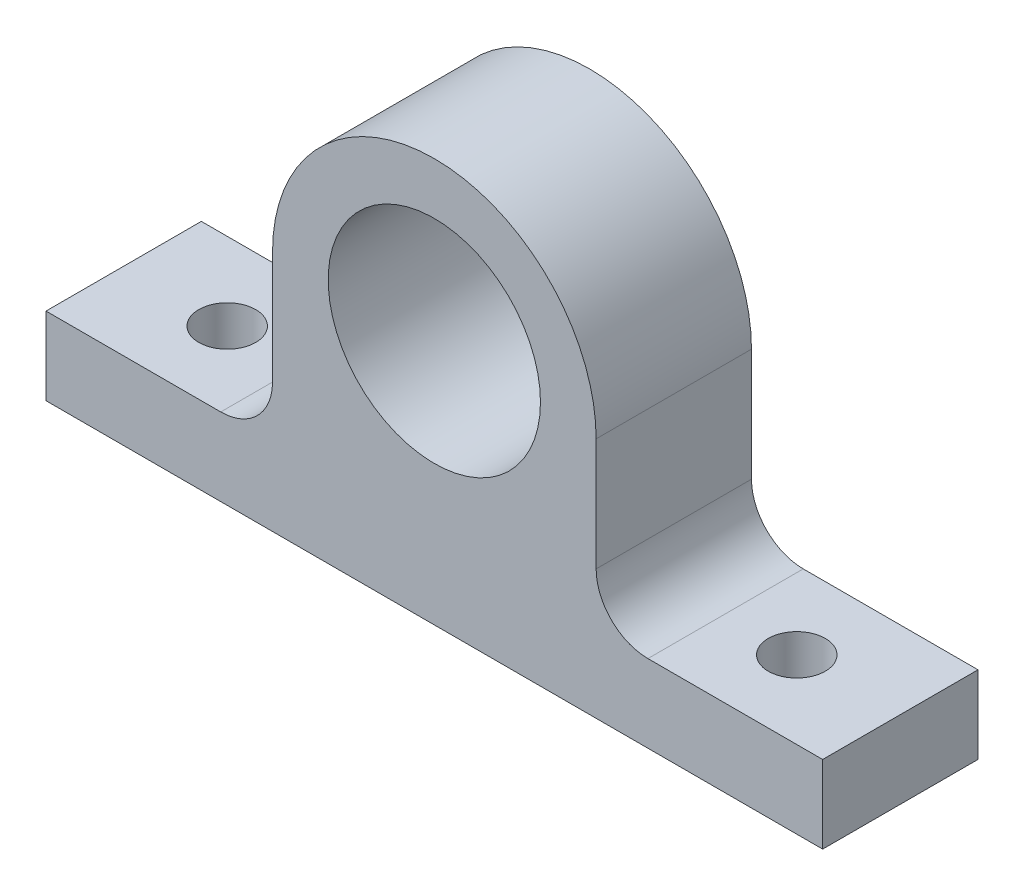
ISO-10303-21;
HEADER;
FILE_DESCRIPTION(('STEP AP214'),'2;1');
FILE_NAME('part.step','',(''),(''),'','','');
FILE_SCHEMA(('AUTOMOTIVE_DESIGN { 1 0 10303 214 1 1 1 1 }'));
ENDSEC;
DATA;
#1=APPLICATION_CONTEXT('core data for automotive mechanical design processes');
#2=APPLICATION_PROTOCOL_DEFINITION('international standard','automotive_design',2000,#1);
#3=PRODUCT_CONTEXT('',#1,'mechanical');
#4=PRODUCT('Part','Part','',(#3));
#5=PRODUCT_RELATED_PRODUCT_CATEGORY('part','',(#4));
#6=PRODUCT_DEFINITION_FORMATION('','',#4);
#7=PRODUCT_DEFINITION_CONTEXT('part definition',#1,'design');
#8=PRODUCT_DEFINITION('design','',#6,#7);
#9=PRODUCT_DEFINITION_SHAPE('','',#8);
#10=(LENGTH_UNIT() NAMED_UNIT(*) SI_UNIT(.MILLI.,.METRE.));
#11=(NAMED_UNIT(*) PLANE_ANGLE_UNIT() SI_UNIT($,.RADIAN.));
#12=(NAMED_UNIT(*) SI_UNIT($,.STERADIAN.) SOLID_ANGLE_UNIT());
#13=UNCERTAINTY_MEASURE_WITH_UNIT(LENGTH_MEASURE(1.E-05),#10,'distance_accuracy_value','');
#14=(GEOMETRIC_REPRESENTATION_CONTEXT(3) GLOBAL_UNCERTAINTY_ASSIGNED_CONTEXT((#13)) GLOBAL_UNIT_ASSIGNED_CONTEXT((#10,
#11,#12)) REPRESENTATION_CONTEXT('',''));
#15=CARTESIAN_POINT('',(0.,0.,0.));
#16=DIRECTION('',(0.,0.,1.));
#17=DIRECTION('',(1.,0.,0.));
#18=AXIS2_PLACEMENT_3D('',#15,#16,#17);
#19=CARTESIAN_POINT('',(0.,-0.15,-3.));
#20=DIRECTION('',(0.,0.,-1.));
#21=DIRECTION('',(-1.,0.,0.));
#22=AXIS2_PLACEMENT_3D('',#19,#20,#21);
#23=CYLINDRICAL_SURFACE('',#22,6.25);
#24=DIRECTION('',(0.,0.,-1.));
#25=VECTOR('',#24,1.);
#26=CARTESIAN_POINT('',(6.25,-0.150000000000001,3.));
#27=LINE('',#26,#25);
#28=CARTESIAN_POINT('',(6.25,-0.150000000000001,-3.));
#29=VERTEX_POINT('',#28);
#30=CARTESIAN_POINT('',(6.25,-0.150000000000001,3.));
#31=VERTEX_POINT('',#30);
#32=EDGE_CURVE('E146',#29,#31,#27,.F.);
#33=ORIENTED_EDGE('',*,*,#32,.F.);
#34=CARTESIAN_POINT('',(0.,-0.15,-3.));
#35=DIRECTION('',(0.,0.,1.));
#36=DIRECTION('',(1.,0.,0.));
#37=AXIS2_PLACEMENT_3D('',#34,#35,#36);
#38=CIRCLE('',#37,6.25);
#39=CARTESIAN_POINT('',(-6.25,-0.150000000000002,-3.));
#40=VERTEX_POINT('',#39);
#41=EDGE_CURVE('E207',#40,#29,#38,.F.);
#42=ORIENTED_EDGE('',*,*,#41,.F.);
#43=DIRECTION('',(0.,0.,-1.));
#44=VECTOR('',#43,1.);
#45=CARTESIAN_POINT('',(-6.25,-0.150000000000001,3.));
#46=LINE('',#45,#44);
#47=CARTESIAN_POINT('',(-6.25,-0.150000000000002,3.));
#48=VERTEX_POINT('',#47);
#49=EDGE_CURVE('E203',#48,#40,#46,.T.);
#50=ORIENTED_EDGE('',*,*,#49,.F.);
#51=CARTESIAN_POINT('',(0.,-0.15,3.));
#52=DIRECTION('',(0.,0.,1.));
#53=DIRECTION('',(1.,0.,0.));
#54=AXIS2_PLACEMENT_3D('',#51,#52,#53);
#55=CIRCLE('',#54,6.25);
#56=EDGE_CURVE('E211',#31,#48,#55,.T.);
#57=ORIENTED_EDGE('',*,*,#56,.F.);
#58=EDGE_LOOP('',(#33,#42,#50,#57));
#59=FACE_BOUND('',#58,.T.);
#60=ADVANCED_FACE('F47',(#59),#23,.T.);
#61=CARTESIAN_POINT('',(0.,0.,3.));
#62=DIRECTION('',(0.,0.,1.));
#63=DIRECTION('',(1.,0.,0.));
#64=AXIS2_PLACEMENT_3D('',#61,#62,#63);
#65=PLANE('',#64);
#66=DIRECTION('',(-1.,0.,0.));
#67=VECTOR('',#66,1.);
#68=CARTESIAN_POINT('',(6.25,-6.5,3.));
#69=LINE('',#68,#67);
#70=CARTESIAN_POINT('',(15.,-6.5,3.));
#71=VERTEX_POINT('',#70);
#72=CARTESIAN_POINT('',(8.25,-6.5,3.));
#73=VERTEX_POINT('',#72);
#74=EDGE_CURVE('E162',#71,#73,#69,.T.);
#75=ORIENTED_EDGE('',*,*,#74,.T.);
#76=CARTESIAN_POINT('',(8.25,-4.5,3.));
#77=DIRECTION('',(0.,0.,1.));
#78=DIRECTION('',(1.,0.,0.));
#79=AXIS2_PLACEMENT_3D('',#76,#77,#78);
#80=CIRCLE('',#79,2.);
#81=CARTESIAN_POINT('',(6.25,-4.5,3.));
#82=VERTEX_POINT('',#81);
#83=EDGE_CURVE('E229',#73,#82,#80,.F.);
#84=ORIENTED_EDGE('',*,*,#83,.T.);
#85=DIRECTION('',(0.,1.,0.));
#86=VECTOR('',#85,1.);
#87=CARTESIAN_POINT('',(6.25,6.1,3.));
#88=LINE('',#87,#86);
#89=EDGE_CURVE('E165',#82,#31,#88,.T.);
#90=ORIENTED_EDGE('',*,*,#89,.T.);
#91=ORIENTED_EDGE('',*,*,#56,.T.);
#92=DIRECTION('',(0.,-1.,0.));
#93=VECTOR('',#92,1.);
#94=CARTESIAN_POINT('',(-6.25,6.1,3.));
#95=LINE('',#94,#93);
#96=CARTESIAN_POINT('',(-6.25,-4.5,3.));
#97=VERTEX_POINT('',#96);
#98=EDGE_CURVE('E137',#48,#97,#95,.T.);
#99=ORIENTED_EDGE('',*,*,#98,.T.);
#100=CARTESIAN_POINT('',(-8.25,-4.5,3.));
#101=DIRECTION('',(0.,0.,1.));
#102=DIRECTION('',(1.,0.,0.));
#103=AXIS2_PLACEMENT_3D('',#100,#101,#102);
#104=CIRCLE('',#103,2.);
#105=CARTESIAN_POINT('',(-8.25,-6.5,3.));
#106=VERTEX_POINT('',#105);
#107=EDGE_CURVE('E11',#97,#106,#104,.F.);
#108=ORIENTED_EDGE('',*,*,#107,.T.);
#109=DIRECTION('',(-1.,0.,0.));
#110=VECTOR('',#109,1.);
#111=CARTESIAN_POINT('',(-15.,-6.5,3.));
#112=LINE('',#111,#110);
#113=CARTESIAN_POINT('',(-15.,-6.5,3.));
#114=VERTEX_POINT('',#113);
#115=EDGE_CURVE('E124',#106,#114,#112,.T.);
#116=ORIENTED_EDGE('',*,*,#115,.T.);
#117=DIRECTION('',(0.,-1.,0.));
#118=VECTOR('',#117,1.);
#119=CARTESIAN_POINT('',(-15.,-9.5,3.));
#120=LINE('',#119,#118);
#121=CARTESIAN_POINT('',(-15.,-9.5,3.));
#122=VERTEX_POINT('',#121);
#123=EDGE_CURVE('E130',#114,#122,#120,.T.);
#124=ORIENTED_EDGE('',*,*,#123,.T.);
#125=DIRECTION('',(1.,0.,0.));
#126=VECTOR('',#125,1.);
#127=CARTESIAN_POINT('',(-15.,-9.5,3.));
#128=LINE('',#127,#126);
#129=CARTESIAN_POINT('',(15.,-9.5,3.));
#130=VERTEX_POINT('',#129);
#131=EDGE_CURVE('E153',#122,#130,#128,.T.);
#132=ORIENTED_EDGE('',*,*,#131,.T.);
#133=DIRECTION('',(0.,1.,0.));
#134=VECTOR('',#133,1.);
#135=CARTESIAN_POINT('',(15.,-9.5,3.));
#136=LINE('',#135,#134);
#137=EDGE_CURVE('E156',#130,#71,#136,.T.);
#138=ORIENTED_EDGE('',*,*,#137,.T.);
#139=EDGE_LOOP('',(#75,#84,#90,#91,#99,#108,#116,#124,#132,#138));
#140=FACE_BOUND('',#139,.T.);
#141=CARTESIAN_POINT('',(0.,0.,3.));
#142=DIRECTION('',(0.,0.,1.));
#143=DIRECTION('',(1.,0.,0.));
#144=AXIS2_PLACEMENT_3D('',#141,#142,#143);
#145=CIRCLE('',#144,4.1);
#146=CARTESIAN_POINT('',(4.1,0.,3.));
#147=VERTEX_POINT('',#146);
#148=EDGE_CURVE('E172',#147,#147,#145,.T.);
#149=ORIENTED_EDGE('',*,*,#148,.F.);
#150=EDGE_LOOP('',(#149));
#151=FACE_BOUND('',#150,.T.);
#152=ADVANCED_FACE('F127',(#140,#151),#65,.T.);
#153=CARTESIAN_POINT('',(0.,0.,-3.));
#154=DIRECTION('',(0.,0.,1.));
#155=DIRECTION('',(1.,0.,0.));
#156=AXIS2_PLACEMENT_3D('',#153,#154,#155);
#157=PLANE('',#156);
#158=DIRECTION('',(0.,-1.,0.));
#159=VECTOR('',#158,1.);
#160=CARTESIAN_POINT('',(-6.25,6.1,-3.));
#161=LINE('',#160,#159);
#162=CARTESIAN_POINT('',(-6.25,-4.5,-3.));
#163=VERTEX_POINT('',#162);
#164=EDGE_CURVE('E169',#40,#163,#161,.T.);
#165=ORIENTED_EDGE('',*,*,#164,.F.);
#166=ORIENTED_EDGE('',*,*,#41,.T.);
#167=DIRECTION('',(0.,1.,0.));
#168=VECTOR('',#167,1.);
#169=CARTESIAN_POINT('',(6.25,6.1,-3.));
#170=LINE('',#169,#168);
#171=CARTESIAN_POINT('',(6.25,-4.5,-3.));
#172=VERTEX_POINT('',#171);
#173=EDGE_CURVE('E188',#172,#29,#170,.T.);
#174=ORIENTED_EDGE('',*,*,#173,.F.);
#175=CARTESIAN_POINT('',(8.25,-4.5,-3.));
#176=DIRECTION('',(0.,0.,1.));
#177=DIRECTION('',(1.,0.,0.));
#178=AXIS2_PLACEMENT_3D('',#175,#176,#177);
#179=CIRCLE('',#178,2.);
#180=CARTESIAN_POINT('',(8.25,-6.5,-3.));
#181=VERTEX_POINT('',#180);
#182=EDGE_CURVE('E226',#172,#181,#179,.T.);
#183=ORIENTED_EDGE('',*,*,#182,.T.);
#184=DIRECTION('',(-1.,0.,0.));
#185=VECTOR('',#184,1.);
#186=CARTESIAN_POINT('',(6.25,-6.5,-3.));
#187=LINE('',#186,#185);
#188=CARTESIAN_POINT('',(15.,-6.5,-3.));
#189=VERTEX_POINT('',#188);
#190=EDGE_CURVE('E184',#189,#181,#187,.T.);
#191=ORIENTED_EDGE('',*,*,#190,.F.);
#192=DIRECTION('',(0.,1.,0.));
#193=VECTOR('',#192,1.);
#194=CARTESIAN_POINT('',(15.,-9.5,-3.));
#195=LINE('',#194,#193);
#196=CARTESIAN_POINT('',(15.,-9.5,-3.));
#197=VERTEX_POINT('',#196);
#198=EDGE_CURVE('E181',#197,#189,#195,.T.);
#199=ORIENTED_EDGE('',*,*,#198,.F.);
#200=DIRECTION('',(1.,0.,0.));
#201=VECTOR('',#200,1.);
#202=CARTESIAN_POINT('',(-15.,-9.5,-3.));
#203=LINE('',#202,#201);
#204=CARTESIAN_POINT('',(-15.,-9.5,-3.));
#205=VERTEX_POINT('',#204);
#206=EDGE_CURVE('E178',#205,#197,#203,.T.);
#207=ORIENTED_EDGE('',*,*,#206,.F.);
#208=DIRECTION('',(0.,-1.,0.));
#209=VECTOR('',#208,1.);
#210=CARTESIAN_POINT('',(-15.,-9.5,-3.));
#211=LINE('',#210,#209);
#212=CARTESIAN_POINT('',(-15.,-6.5,-3.));
#213=VERTEX_POINT('',#212);
#214=EDGE_CURVE('E175',#213,#205,#211,.T.);
#215=ORIENTED_EDGE('',*,*,#214,.F.);
#216=DIRECTION('',(-1.,0.,0.));
#217=VECTOR('',#216,1.);
#218=CARTESIAN_POINT('',(-15.,-6.5,-3.));
#219=LINE('',#218,#217);
#220=CARTESIAN_POINT('',(-8.25,-6.5,-3.));
#221=VERTEX_POINT('',#220);
#222=EDGE_CURVE('E142',#221,#213,#219,.T.);
#223=ORIENTED_EDGE('',*,*,#222,.F.);
#224=CARTESIAN_POINT('',(-8.25,-4.5,-3.));
#225=DIRECTION('',(0.,0.,1.));
#226=DIRECTION('',(1.,0.,0.));
#227=AXIS2_PLACEMENT_3D('',#224,#225,#226);
#228=CIRCLE('',#227,2.);
#229=EDGE_CURVE('E56',#221,#163,#228,.T.);
#230=ORIENTED_EDGE('',*,*,#229,.T.);
#231=EDGE_LOOP('',(#165,#166,#174,#183,#191,#199,#207,#215,#223,#230));
#232=FACE_BOUND('',#231,.T.);
#233=CARTESIAN_POINT('',(0.,0.,-3.));
#234=DIRECTION('',(0.,0.,1.));
#235=DIRECTION('',(1.,0.,0.));
#236=AXIS2_PLACEMENT_3D('',#233,#234,#235);
#237=CIRCLE('',#236,4.1);
#238=CARTESIAN_POINT('',(4.1,0.,-3.));
#239=VERTEX_POINT('',#238);
#240=EDGE_CURVE('E328',#239,#239,#237,.T.);
#241=ORIENTED_EDGE('',*,*,#240,.T.);
#242=EDGE_LOOP('',(#241));
#243=FACE_BOUND('',#242,.T.);
#244=ADVANCED_FACE('F245',(#232,#243),#157,.F.);
#245=CARTESIAN_POINT('',(-6.25,6.1,3.));
#246=DIRECTION('',(1.,0.,0.));
#247=DIRECTION('',(0.,1.,0.));
#248=AXIS2_PLACEMENT_3D('',#245,#246,#247);
#249=PLANE('',#248);
#250=ORIENTED_EDGE('',*,*,#164,.T.);
#251=DIRECTION('',(0.,0.,-1.));
#252=VECTOR('',#251,1.);
#253=CARTESIAN_POINT('',(-6.25,-4.5,3.));
#254=LINE('',#253,#252);
#255=EDGE_CURVE('E69',#163,#97,#254,.F.);
#256=ORIENTED_EDGE('',*,*,#255,.T.);
#257=ORIENTED_EDGE('',*,*,#98,.F.);
#258=ORIENTED_EDGE('',*,*,#49,.T.);
#259=EDGE_LOOP('',(#250,#256,#257,#258));
#260=FACE_BOUND('',#259,.T.);
#261=ADVANCED_FACE('F283',(#260),#249,.F.);
#262=CARTESIAN_POINT('',(-15.,-6.5,3.));
#263=DIRECTION('',(0.,-1.,0.));
#264=DIRECTION('',(1.,0.,0.));
#265=AXIS2_PLACEMENT_3D('',#262,#263,#264);
#266=PLANE('',#265);
#267=CARTESIAN_POINT('',(-11.,-6.5,0.));
#268=DIRECTION('',(0.,1.,0.));
#269=DIRECTION('',(-1.,0.,0.));
#270=AXIS2_PLACEMENT_3D('',#267,#268,#269);
#271=CIRCLE('',#270,1.1);
#272=CARTESIAN_POINT('',(-12.1,-6.5,0.));
#273=VERTEX_POINT('',#272);
#274=EDGE_CURVE('E314',#273,#273,#271,.T.);
#275=ORIENTED_EDGE('',*,*,#274,.F.);
#276=EDGE_LOOP('',(#275));
#277=FACE_BOUND('',#276,.T.);
#278=ORIENTED_EDGE('',*,*,#115,.F.);
#279=DIRECTION('',(0.,0.,-1.));
#280=VECTOR('',#279,1.);
#281=CARTESIAN_POINT('',(-8.25,-6.5,-3.));
#282=LINE('',#281,#280);
#283=EDGE_CURVE('E221',#106,#221,#282,.T.);
#284=ORIENTED_EDGE('',*,*,#283,.T.);
#285=ORIENTED_EDGE('',*,*,#222,.T.);
#286=DIRECTION('',(0.,0.,-1.));
#287=VECTOR('',#286,1.);
#288=CARTESIAN_POINT('',(-15.,-6.5,3.));
#289=LINE('',#288,#287);
#290=EDGE_CURVE('E140',#114,#213,#289,.T.);
#291=ORIENTED_EDGE('',*,*,#290,.F.);
#292=EDGE_LOOP('',(#278,#284,#285,#291));
#293=FACE_BOUND('',#292,.T.);
#294=ADVANCED_FACE('F141',(#277,#293),#266,.F.);
#295=CARTESIAN_POINT('',(-15.,-9.5,3.));
#296=DIRECTION('',(1.,0.,0.));
#297=DIRECTION('',(0.,0.,-1.));
#298=AXIS2_PLACEMENT_3D('',#295,#296,#297);
#299=PLANE('',#298);
#300=ORIENTED_EDGE('',*,*,#214,.T.);
#301=DIRECTION('',(0.,0.,-1.));
#302=VECTOR('',#301,1.);
#303=CARTESIAN_POINT('',(-15.,-9.5,3.));
#304=LINE('',#303,#302);
#305=EDGE_CURVE('E147',#122,#205,#304,.T.);
#306=ORIENTED_EDGE('',*,*,#305,.F.);
#307=ORIENTED_EDGE('',*,*,#123,.F.);
#308=ORIENTED_EDGE('',*,*,#290,.T.);
#309=EDGE_LOOP('',(#300,#306,#307,#308));
#310=FACE_BOUND('',#309,.T.);
#311=ADVANCED_FACE('F149',(#310),#299,.F.);
#312=CARTESIAN_POINT('',(-15.,-9.5,3.));
#313=DIRECTION('',(0.,1.,0.));
#314=DIRECTION('',(0.,0.,1.));
#315=AXIS2_PLACEMENT_3D('',#312,#313,#314);
#316=PLANE('',#315);
#317=CARTESIAN_POINT('',(-11.,-9.5,0.));
#318=DIRECTION('',(0.,1.,0.));
#319=DIRECTION('',(0.,0.,1.));
#320=AXIS2_PLACEMENT_3D('',#317,#318,#319);
#321=CIRCLE('',#320,1.1);
#322=CARTESIAN_POINT('',(-11.,-9.5,1.1));
#323=VERTEX_POINT('',#322);
#324=EDGE_CURVE('E320',#323,#323,#321,.F.);
#325=ORIENTED_EDGE('',*,*,#324,.F.);
#326=EDGE_LOOP('',(#325));
#327=FACE_BOUND('',#326,.T.);
#328=CARTESIAN_POINT('',(11.,-9.5,0.));
#329=DIRECTION('',(0.,1.,0.));
#330=DIRECTION('',(0.,0.,1.));
#331=AXIS2_PLACEMENT_3D('',#328,#329,#330);
#332=CIRCLE('',#331,1.1);
#333=CARTESIAN_POINT('',(11.,-9.5,1.1));
#334=VERTEX_POINT('',#333);
#335=EDGE_CURVE('E315',#334,#334,#332,.F.);
#336=ORIENTED_EDGE('',*,*,#335,.F.);
#337=EDGE_LOOP('',(#336));
#338=FACE_BOUND('',#337,.T.);
#339=ORIENTED_EDGE('',*,*,#206,.T.);
#340=DIRECTION('',(0.,0.,-1.));
#341=VECTOR('',#340,1.);
#342=CARTESIAN_POINT('',(15.,-9.5,3.));
#343=LINE('',#342,#341);
#344=EDGE_CURVE('E194',#130,#197,#343,.T.);
#345=ORIENTED_EDGE('',*,*,#344,.F.);
#346=ORIENTED_EDGE('',*,*,#131,.F.);
#347=ORIENTED_EDGE('',*,*,#305,.T.);
#348=EDGE_LOOP('',(#339,#345,#346,#347));
#349=FACE_BOUND('',#348,.T.);
#350=ADVANCED_FACE('F257',(#327,#338,#349),#316,.F.);
#351=CARTESIAN_POINT('',(15.,-9.5,3.));
#352=DIRECTION('',(-1.,0.,0.));
#353=DIRECTION('',(0.,0.,1.));
#354=AXIS2_PLACEMENT_3D('',#351,#352,#353);
#355=PLANE('',#354);
#356=ORIENTED_EDGE('',*,*,#198,.T.);
#357=DIRECTION('',(0.,0.,-1.));
#358=VECTOR('',#357,1.);
#359=CARTESIAN_POINT('',(15.,-6.5,3.));
#360=LINE('',#359,#358);
#361=EDGE_CURVE('E168',#71,#189,#360,.T.);
#362=ORIENTED_EDGE('',*,*,#361,.F.);
#363=ORIENTED_EDGE('',*,*,#137,.F.);
#364=ORIENTED_EDGE('',*,*,#344,.T.);
#365=EDGE_LOOP('',(#356,#362,#363,#364));
#366=FACE_BOUND('',#365,.T.);
#367=ADVANCED_FACE('F253',(#366),#355,.F.);
#368=CARTESIAN_POINT('',(6.25,-6.5,3.));
#369=DIRECTION('',(0.,-1.,0.));
#370=DIRECTION('',(1.,0.,0.));
#371=AXIS2_PLACEMENT_3D('',#368,#369,#370);
#372=PLANE('',#371);
#373=CARTESIAN_POINT('',(11.,-6.5,0.));
#374=DIRECTION('',(0.,1.,0.));
#375=DIRECTION('',(-1.,0.,0.));
#376=AXIS2_PLACEMENT_3D('',#373,#374,#375);
#377=CIRCLE('',#376,1.1);
#378=CARTESIAN_POINT('',(9.9,-6.5,0.));
#379=VERTEX_POINT('',#378);
#380=EDGE_CURVE('E311',#379,#379,#377,.T.);
#381=ORIENTED_EDGE('',*,*,#380,.F.);
#382=EDGE_LOOP('',(#381));
#383=FACE_BOUND('',#382,.T.);
#384=ORIENTED_EDGE('',*,*,#190,.T.);
#385=DIRECTION('',(0.,0.,-1.));
#386=VECTOR('',#385,1.);
#387=CARTESIAN_POINT('',(8.25,-6.5,3.));
#388=LINE('',#387,#386);
#389=EDGE_CURVE('E218',#181,#73,#388,.F.);
#390=ORIENTED_EDGE('',*,*,#389,.T.);
#391=ORIENTED_EDGE('',*,*,#74,.F.);
#392=ORIENTED_EDGE('',*,*,#361,.T.);
#393=EDGE_LOOP('',(#384,#390,#391,#392));
#394=FACE_BOUND('',#393,.T.);
#395=ADVANCED_FACE('F249',(#383,#394),#372,.F.);
#396=CARTESIAN_POINT('',(6.25,6.1,3.));
#397=DIRECTION('',(-1.,0.,0.));
#398=DIRECTION('',(0.,-1.,0.));
#399=AXIS2_PLACEMENT_3D('',#396,#397,#398);
#400=PLANE('',#399);
#401=ORIENTED_EDGE('',*,*,#89,.F.);
#402=DIRECTION('',(0.,0.,-1.));
#403=VECTOR('',#402,1.);
#404=CARTESIAN_POINT('',(6.25,-4.5,-3.));
#405=LINE('',#404,#403);
#406=EDGE_CURVE('E214',#82,#172,#405,.T.);
#407=ORIENTED_EDGE('',*,*,#406,.T.);
#408=ORIENTED_EDGE('',*,*,#173,.T.);
#409=ORIENTED_EDGE('',*,*,#32,.T.);
#410=EDGE_LOOP('',(#401,#407,#408,#409));
#411=FACE_BOUND('',#410,.T.);
#412=ADVANCED_FACE('F240',(#411),#400,.F.);
#413=CARTESIAN_POINT('',(0.,0.,3.));
#414=DIRECTION('',(0.,0.,-1.));
#415=DIRECTION('',(-1.,0.,0.));
#416=AXIS2_PLACEMENT_3D('',#413,#414,#415);
#417=CYLINDRICAL_SURFACE('',#416,4.1);
#418=ORIENTED_EDGE('',*,*,#148,.T.);
#419=EDGE_LOOP('',(#418));
#420=FACE_BOUND('',#419,.T.);
#421=ORIENTED_EDGE('',*,*,#240,.F.);
#422=EDGE_LOOP('',(#421));
#423=FACE_BOUND('',#422,.T.);
#424=ADVANCED_FACE('F286',(#420,#423),#417,.F.);
#425=CARTESIAN_POINT('',(8.25,-4.5,3.));
#426=DIRECTION('',(0.,0.,1.));
#427=DIRECTION('',(1.,0.,0.));
#428=AXIS2_PLACEMENT_3D('',#425,#426,#427);
#429=CYLINDRICAL_SURFACE('',#428,2.);
#430=ORIENTED_EDGE('',*,*,#83,.F.);
#431=ORIENTED_EDGE('',*,*,#389,.F.);
#432=ORIENTED_EDGE('',*,*,#182,.F.);
#433=ORIENTED_EDGE('',*,*,#406,.F.);
#434=EDGE_LOOP('',(#430,#431,#432,#433));
#435=FACE_BOUND('',#434,.T.);
#436=ADVANCED_FACE('F243',(#435),#429,.F.);
#437=CARTESIAN_POINT('',(-8.25,-4.5,3.));
#438=DIRECTION('',(0.,0.,1.));
#439=DIRECTION('',(1.,0.,0.));
#440=AXIS2_PLACEMENT_3D('',#437,#438,#439);
#441=CYLINDRICAL_SURFACE('',#440,2.);
#442=ORIENTED_EDGE('',*,*,#107,.F.);
#443=ORIENTED_EDGE('',*,*,#255,.F.);
#444=ORIENTED_EDGE('',*,*,#229,.F.);
#445=ORIENTED_EDGE('',*,*,#283,.F.);
#446=EDGE_LOOP('',(#442,#443,#444,#445));
#447=FACE_BOUND('',#446,.T.);
#448=ADVANCED_FACE('F49',(#447),#441,.F.);
#449=CARTESIAN_POINT('',(11.,-12.6112698372208,0.));
#450=DIRECTION('',(0.,1.,0.));
#451=DIRECTION('',(-1.,0.,0.));
#452=AXIS2_PLACEMENT_3D('',#449,#450,#451);
#453=CYLINDRICAL_SURFACE('',#452,1.1);
#454=ORIENTED_EDGE('',*,*,#335,.T.);
#455=EDGE_LOOP('',(#454));
#456=FACE_BOUND('',#455,.T.);
#457=ORIENTED_EDGE('',*,*,#380,.T.);
#458=EDGE_LOOP('',(#457));
#459=FACE_BOUND('',#458,.T.);
#460=ADVANCED_FACE('F291',(#456,#459),#453,.F.);
#461=CARTESIAN_POINT('',(-11.,-12.6112698372208,0.));
#462=DIRECTION('',(0.,1.,0.));
#463=DIRECTION('',(-1.,0.,0.));
#464=AXIS2_PLACEMENT_3D('',#461,#462,#463);
#465=CYLINDRICAL_SURFACE('',#464,1.1);
#466=ORIENTED_EDGE('',*,*,#324,.T.);
#467=EDGE_LOOP('',(#466));
#468=FACE_BOUND('',#467,.T.);
#469=ORIENTED_EDGE('',*,*,#274,.T.);
#470=EDGE_LOOP('',(#469));
#471=FACE_BOUND('',#470,.T.);
#472=ADVANCED_FACE('F341',(#468,#471),#465,.F.);
#473=CLOSED_SHELL('',(#60,#152,#244,#261,#294,#311,#350,#367,#395,#412,#424,#436,#448,#460,#472));
#474=MANIFOLD_SOLID_BREP('B2',#473);
#475=ADVANCED_BREP_SHAPE_REPRESENTATION('',(#18,#474),#14);
#476=SHAPE_DEFINITION_REPRESENTATION(#9,#475);
ENDSEC;
END-ISO-10303-21;
